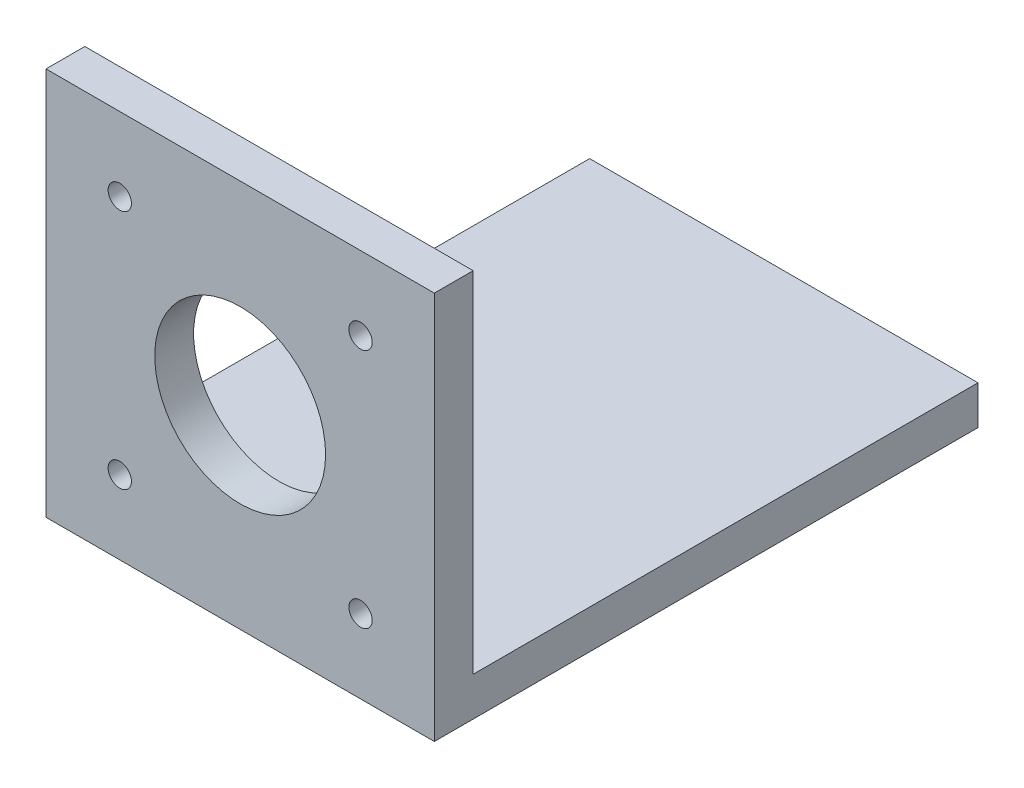
ISO-10303-21;
HEADER;
FILE_DESCRIPTION(('STEP AP214'),'2;1');
FILE_NAME('part.step','',(''),(''),'','','');
FILE_SCHEMA(('AUTOMOTIVE_DESIGN { 1 0 10303 214 1 1 1 1 }'));
ENDSEC;
DATA;
#1=APPLICATION_CONTEXT('core data for automotive mechanical design processes');
#2=APPLICATION_PROTOCOL_DEFINITION('international standard','automotive_design',2000,#1);
#3=PRODUCT_CONTEXT('',#1,'mechanical');
#4=PRODUCT('Part','Part','',(#3));
#5=PRODUCT_RELATED_PRODUCT_CATEGORY('part','',(#4));
#6=PRODUCT_DEFINITION_FORMATION('','',#4);
#7=PRODUCT_DEFINITION_CONTEXT('part definition',#1,'design');
#8=PRODUCT_DEFINITION('design','',#6,#7);
#9=PRODUCT_DEFINITION_SHAPE('','',#8);
#10=(LENGTH_UNIT() NAMED_UNIT(*) SI_UNIT(.MILLI.,.METRE.));
#11=(NAMED_UNIT(*) PLANE_ANGLE_UNIT() SI_UNIT($,.RADIAN.));
#12=(NAMED_UNIT(*) SI_UNIT($,.STERADIAN.) SOLID_ANGLE_UNIT());
#13=UNCERTAINTY_MEASURE_WITH_UNIT(LENGTH_MEASURE(1.E-05),#10,'distance_accuracy_value','');
#14=(GEOMETRIC_REPRESENTATION_CONTEXT(3) GLOBAL_UNCERTAINTY_ASSIGNED_CONTEXT((#13)) GLOBAL_UNIT_ASSIGNED_CONTEXT((#10,
#11,#12)) REPRESENTATION_CONTEXT('',''));
#15=CARTESIAN_POINT('',(0.,0.,0.));
#16=DIRECTION('',(0.,0.,1.));
#17=DIRECTION('',(1.,0.,0.));
#18=AXIS2_PLACEMENT_3D('',#15,#16,#17);
#19=CARTESIAN_POINT('',(50.,0.,0.));
#20=DIRECTION('',(0.,1.,0.));
#21=DIRECTION('',(0.,0.,1.));
#22=AXIS2_PLACEMENT_3D('',#19,#20,#21);
#23=PLANE('',#22);
#24=DIRECTION('',(0.,0.,-1.));
#25=VECTOR('',#24,1.);
#26=CARTESIAN_POINT('',(0.,0.,0.));
#27=LINE('',#26,#25);
#28=CARTESIAN_POINT('',(0.,0.,0.));
#29=VERTEX_POINT('',#28);
#30=CARTESIAN_POINT('',(0.,0.,-70.));
#31=VERTEX_POINT('',#30);
#32=EDGE_CURVE('E119',#29,#31,#27,.T.);
#33=ORIENTED_EDGE('',*,*,#32,.T.);
#34=DIRECTION('',(-1.,0.,0.));
#35=VECTOR('',#34,1.);
#36=CARTESIAN_POINT('',(50.,0.,-70.));
#37=LINE('',#36,#35);
#38=CARTESIAN_POINT('',(50.,0.,-70.));
#39=VERTEX_POINT('',#38);
#40=EDGE_CURVE('E11',#39,#31,#37,.T.);
#41=ORIENTED_EDGE('',*,*,#40,.F.);
#42=DIRECTION('',(0.,0.,-1.));
#43=VECTOR('',#42,1.);
#44=CARTESIAN_POINT('',(50.,0.,0.));
#45=LINE('',#44,#43);
#46=CARTESIAN_POINT('',(50.,0.,0.));
#47=VERTEX_POINT('',#46);
#48=EDGE_CURVE('E130',#47,#39,#45,.T.);
#49=ORIENTED_EDGE('',*,*,#48,.F.);
#50=DIRECTION('',(-1.,0.,0.));
#51=VECTOR('',#50,1.);
#52=CARTESIAN_POINT('',(50.,0.,0.));
#53=LINE('',#52,#51);
#54=EDGE_CURVE('E115',#47,#29,#53,.T.);
#55=ORIENTED_EDGE('',*,*,#54,.T.);
#56=EDGE_LOOP('',(#33,#41,#49,#55));
#57=FACE_BOUND('',#56,.T.);
#58=ADVANCED_FACE('F35',(#57),#23,.F.);
#59=CARTESIAN_POINT('',(50.,0.,-70.));
#60=DIRECTION('',(0.,0.,1.));
#61=DIRECTION('',(1.,0.,0.));
#62=AXIS2_PLACEMENT_3D('',#59,#60,#61);
#63=PLANE('',#62);
#64=DIRECTION('',(0.,1.,0.));
#65=VECTOR('',#64,1.);
#66=CARTESIAN_POINT('',(0.,0.,-70.));
#67=LINE('',#66,#65);
#68=CARTESIAN_POINT('',(0.,5.,-70.));
#69=VERTEX_POINT('',#68);
#70=EDGE_CURVE('E122',#31,#69,#67,.T.);
#71=ORIENTED_EDGE('',*,*,#70,.T.);
#72=DIRECTION('',(-1.,0.,0.));
#73=VECTOR('',#72,1.);
#74=CARTESIAN_POINT('',(50.,5.,-70.));
#75=LINE('',#74,#73);
#76=CARTESIAN_POINT('',(50.,5.,-70.));
#77=VERTEX_POINT('',#76);
#78=EDGE_CURVE('E43',#77,#69,#75,.T.);
#79=ORIENTED_EDGE('',*,*,#78,.F.);
#80=DIRECTION('',(0.,1.,0.));
#81=VECTOR('',#80,1.);
#82=CARTESIAN_POINT('',(50.,0.,-70.));
#83=LINE('',#82,#81);
#84=EDGE_CURVE('E88',#39,#77,#83,.T.);
#85=ORIENTED_EDGE('',*,*,#84,.F.);
#86=ORIENTED_EDGE('',*,*,#40,.T.);
#87=EDGE_LOOP('',(#71,#79,#85,#86));
#88=FACE_BOUND('',#87,.T.);
#89=ADVANCED_FACE('F157',(#88),#63,.F.);
#90=CARTESIAN_POINT('',(50.,5.,-5.));
#91=DIRECTION('',(0.,-1.,0.));
#92=DIRECTION('',(0.,0.,-1.));
#93=AXIS2_PLACEMENT_3D('',#90,#91,#92);
#94=PLANE('',#93);
#95=DIRECTION('',(0.,0.,1.));
#96=VECTOR('',#95,1.);
#97=CARTESIAN_POINT('',(0.,5.,-5.));
#98=LINE('',#97,#96);
#99=CARTESIAN_POINT('',(0.,5.,-5.));
#100=VERTEX_POINT('',#99);
#101=EDGE_CURVE('E125',#69,#100,#98,.T.);
#102=ORIENTED_EDGE('',*,*,#101,.T.);
#103=DIRECTION('',(-1.,0.,0.));
#104=VECTOR('',#103,1.);
#105=CARTESIAN_POINT('',(50.,5.,-5.));
#106=LINE('',#105,#104);
#107=CARTESIAN_POINT('',(50.,5.,-5.));
#108=VERTEX_POINT('',#107);
#109=EDGE_CURVE('E110',#108,#100,#106,.T.);
#110=ORIENTED_EDGE('',*,*,#109,.F.);
#111=DIRECTION('',(0.,0.,1.));
#112=VECTOR('',#111,1.);
#113=CARTESIAN_POINT('',(50.,5.,-5.));
#114=LINE('',#113,#112);
#115=EDGE_CURVE('E101',#77,#108,#114,.T.);
#116=ORIENTED_EDGE('',*,*,#115,.F.);
#117=ORIENTED_EDGE('',*,*,#78,.T.);
#118=EDGE_LOOP('',(#102,#110,#116,#117));
#119=FACE_BOUND('',#118,.T.);
#120=ADVANCED_FACE('F136',(#119),#94,.F.);
#121=CARTESIAN_POINT('',(50.,5.,-5.));
#122=DIRECTION('',(0.,0.,1.));
#123=DIRECTION('',(1.,0.,0.));
#124=AXIS2_PLACEMENT_3D('',#121,#122,#123);
#125=PLANE('',#124);
#126=CARTESIAN_POINT('',(40.5,9.5,-5.));
#127=DIRECTION('',(0.,0.,1.));
#128=DIRECTION('',(1.,0.,0.));
#129=AXIS2_PLACEMENT_3D('',#126,#127,#128);
#130=CIRCLE('',#129,1.5);
#131=CARTESIAN_POINT('',(42.,9.5,-5.));
#132=VERTEX_POINT('',#131);
#133=EDGE_CURVE('E173',#132,#132,#130,.F.);
#134=ORIENTED_EDGE('',*,*,#133,.F.);
#135=EDGE_LOOP('',(#134));
#136=FACE_BOUND('',#135,.T.);
#137=CARTESIAN_POINT('',(9.49999999999973,9.5,-5.));
#138=DIRECTION('',(0.,0.,1.));
#139=DIRECTION('',(1.,0.,0.));
#140=AXIS2_PLACEMENT_3D('',#137,#138,#139);
#141=CIRCLE('',#140,1.50000000000001);
#142=CARTESIAN_POINT('',(10.9999999999997,9.5,-5.));
#143=VERTEX_POINT('',#142);
#144=EDGE_CURVE('E177',#143,#143,#141,.F.);
#145=ORIENTED_EDGE('',*,*,#144,.F.);
#146=EDGE_LOOP('',(#145));
#147=FACE_BOUND('',#146,.T.);
#148=CARTESIAN_POINT('',(9.49999999999973,40.5,-5.));
#149=DIRECTION('',(0.,0.,1.));
#150=DIRECTION('',(1.,0.,0.));
#151=AXIS2_PLACEMENT_3D('',#148,#149,#150);
#152=CIRCLE('',#151,1.50000000000001);
#153=CARTESIAN_POINT('',(10.9999999999997,40.5,-5.));
#154=VERTEX_POINT('',#153);
#155=EDGE_CURVE('E181',#154,#154,#152,.F.);
#156=ORIENTED_EDGE('',*,*,#155,.F.);
#157=EDGE_LOOP('',(#156));
#158=FACE_BOUND('',#157,.T.);
#159=CARTESIAN_POINT('',(40.5,40.5,-5.));
#160=DIRECTION('',(0.,0.,1.));
#161=DIRECTION('',(1.,0.,0.));
#162=AXIS2_PLACEMENT_3D('',#159,#160,#161);
#163=CIRCLE('',#162,1.5);
#164=CARTESIAN_POINT('',(42.,40.5,-5.));
#165=VERTEX_POINT('',#164);
#166=EDGE_CURVE('E185',#165,#165,#163,.F.);
#167=ORIENTED_EDGE('',*,*,#166,.F.);
#168=EDGE_LOOP('',(#167));
#169=FACE_BOUND('',#168,.T.);
#170=CARTESIAN_POINT('',(25.0000000000028,25.0000000000028,-5.));
#171=DIRECTION('',(0.,0.,1.));
#172=DIRECTION('',(1.,0.,0.));
#173=AXIS2_PLACEMENT_3D('',#170,#171,#172);
#174=CIRCLE('',#173,11.);
#175=CARTESIAN_POINT('',(36.0000000000028,25.0000000000028,-5.));
#176=VERTEX_POINT('',#175);
#177=EDGE_CURVE('E123',#176,#176,#174,.F.);
#178=ORIENTED_EDGE('',*,*,#177,.F.);
#179=EDGE_LOOP('',(#178));
#180=FACE_BOUND('',#179,.T.);
#181=DIRECTION('',(0.,1.,0.));
#182=VECTOR('',#181,1.);
#183=CARTESIAN_POINT('',(0.,5.,-5.));
#184=LINE('',#183,#182);
#185=CARTESIAN_POINT('',(0.,50.,-5.));
#186=VERTEX_POINT('',#185);
#187=EDGE_CURVE('E109',#100,#186,#184,.T.);
#188=ORIENTED_EDGE('',*,*,#187,.T.);
#189=DIRECTION('',(-1.,0.,0.));
#190=VECTOR('',#189,1.);
#191=CARTESIAN_POINT('',(50.,50.,-5.));
#192=LINE('',#191,#190);
#193=CARTESIAN_POINT('',(50.,50.,-5.));
#194=VERTEX_POINT('',#193);
#195=EDGE_CURVE('E106',#194,#186,#192,.T.);
#196=ORIENTED_EDGE('',*,*,#195,.F.);
#197=DIRECTION('',(0.,1.,0.));
#198=VECTOR('',#197,1.);
#199=CARTESIAN_POINT('',(50.,5.,-5.));
#200=LINE('',#199,#198);
#201=EDGE_CURVE('E95',#108,#194,#200,.T.);
#202=ORIENTED_EDGE('',*,*,#201,.F.);
#203=ORIENTED_EDGE('',*,*,#109,.T.);
#204=EDGE_LOOP('',(#188,#196,#202,#203));
#205=FACE_BOUND('',#204,.T.);
#206=ADVANCED_FACE('F107',(#136,#147,#158,#169,#180,#205),#125,.F.);
#207=CARTESIAN_POINT('',(50.,50.,0.));
#208=DIRECTION('',(0.,-1.,0.));
#209=DIRECTION('',(0.,0.,-1.));
#210=AXIS2_PLACEMENT_3D('',#207,#208,#209);
#211=PLANE('',#210);
#212=DIRECTION('',(0.,0.,1.));
#213=VECTOR('',#212,1.);
#214=CARTESIAN_POINT('',(0.,50.,0.));
#215=LINE('',#214,#213);
#216=CARTESIAN_POINT('',(0.,50.,0.));
#217=VERTEX_POINT('',#216);
#218=EDGE_CURVE('E74',#186,#217,#215,.T.);
#219=ORIENTED_EDGE('',*,*,#218,.T.);
#220=DIRECTION('',(-1.,0.,0.));
#221=VECTOR('',#220,1.);
#222=CARTESIAN_POINT('',(50.,50.,0.));
#223=LINE('',#222,#221);
#224=CARTESIAN_POINT('',(50.,50.,0.));
#225=VERTEX_POINT('',#224);
#226=EDGE_CURVE('E111',#225,#217,#223,.T.);
#227=ORIENTED_EDGE('',*,*,#226,.F.);
#228=DIRECTION('',(0.,0.,1.));
#229=VECTOR('',#228,1.);
#230=CARTESIAN_POINT('',(50.,50.,0.));
#231=LINE('',#230,#229);
#232=EDGE_CURVE('E99',#194,#225,#231,.T.);
#233=ORIENTED_EDGE('',*,*,#232,.F.);
#234=ORIENTED_EDGE('',*,*,#195,.T.);
#235=EDGE_LOOP('',(#219,#227,#233,#234));
#236=FACE_BOUND('',#235,.T.);
#237=ADVANCED_FACE('F113',(#236),#211,.F.);
#238=CARTESIAN_POINT('',(50.,0.,0.));
#239=DIRECTION('',(0.,0.,-1.));
#240=DIRECTION('',(-1.,0.,0.));
#241=AXIS2_PLACEMENT_3D('',#238,#239,#240);
#242=PLANE('',#241);
#243=CARTESIAN_POINT('',(40.5,9.5,0.));
#244=DIRECTION('',(0.,0.,1.));
#245=DIRECTION('',(-1.,0.,0.));
#246=AXIS2_PLACEMENT_3D('',#243,#244,#245);
#247=CIRCLE('',#246,1.5);
#248=CARTESIAN_POINT('',(39.,9.5,0.));
#249=VERTEX_POINT('',#248);
#250=EDGE_CURVE('E198',#249,#249,#247,.T.);
#251=ORIENTED_EDGE('',*,*,#250,.F.);
#252=EDGE_LOOP('',(#251));
#253=FACE_BOUND('',#252,.T.);
#254=CARTESIAN_POINT('',(9.49999999999973,9.5,0.));
#255=DIRECTION('',(0.,0.,1.));
#256=DIRECTION('',(1.,0.,0.));
#257=AXIS2_PLACEMENT_3D('',#254,#255,#256);
#258=CIRCLE('',#257,1.50000000000001);
#259=CARTESIAN_POINT('',(10.9999999999997,9.5,0.));
#260=VERTEX_POINT('',#259);
#261=EDGE_CURVE('E197',#260,#260,#258,.T.);
#262=ORIENTED_EDGE('',*,*,#261,.F.);
#263=EDGE_LOOP('',(#262));
#264=FACE_BOUND('',#263,.T.);
#265=CARTESIAN_POINT('',(9.49999999999973,40.5,0.));
#266=DIRECTION('',(0.,0.,1.));
#267=DIRECTION('',(-1.,0.,0.));
#268=AXIS2_PLACEMENT_3D('',#265,#266,#267);
#269=CIRCLE('',#268,1.50000000000001);
#270=CARTESIAN_POINT('',(7.99999999999973,40.5,0.));
#271=VERTEX_POINT('',#270);
#272=EDGE_CURVE('E202',#271,#271,#269,.T.);
#273=ORIENTED_EDGE('',*,*,#272,.F.);
#274=EDGE_LOOP('',(#273));
#275=FACE_BOUND('',#274,.T.);
#276=CARTESIAN_POINT('',(40.5,40.5,0.));
#277=DIRECTION('',(0.,0.,1.));
#278=DIRECTION('',(1.,0.,0.));
#279=AXIS2_PLACEMENT_3D('',#276,#277,#278);
#280=CIRCLE('',#279,1.5);
#281=CARTESIAN_POINT('',(42.,40.5,0.));
#282=VERTEX_POINT('',#281);
#283=EDGE_CURVE('E206',#282,#282,#280,.T.);
#284=ORIENTED_EDGE('',*,*,#283,.F.);
#285=EDGE_LOOP('',(#284));
#286=FACE_BOUND('',#285,.T.);
#287=CARTESIAN_POINT('',(25.0000000000028,25.0000000000028,0.));
#288=DIRECTION('',(0.,0.,1.));
#289=DIRECTION('',(1.,0.,0.));
#290=AXIS2_PLACEMENT_3D('',#287,#288,#289);
#291=CIRCLE('',#290,11.);
#292=CARTESIAN_POINT('',(36.0000000000028,25.0000000000028,0.));
#293=VERTEX_POINT('',#292);
#294=EDGE_CURVE('E189',#293,#293,#291,.T.);
#295=ORIENTED_EDGE('',*,*,#294,.F.);
#296=EDGE_LOOP('',(#295));
#297=FACE_BOUND('',#296,.T.);
#298=DIRECTION('',(0.,-1.,0.));
#299=VECTOR('',#298,1.);
#300=CARTESIAN_POINT('',(0.,0.,0.));
#301=LINE('',#300,#299);
#302=EDGE_CURVE('E80',#217,#29,#301,.T.);
#303=ORIENTED_EDGE('',*,*,#302,.T.);
#304=ORIENTED_EDGE('',*,*,#54,.F.);
#305=DIRECTION('',(0.,-1.,0.));
#306=VECTOR('',#305,1.);
#307=CARTESIAN_POINT('',(50.,0.,0.));
#308=LINE('',#307,#306);
#309=EDGE_CURVE('E51',#225,#47,#308,.T.);
#310=ORIENTED_EDGE('',*,*,#309,.F.);
#311=ORIENTED_EDGE('',*,*,#226,.T.);
#312=EDGE_LOOP('',(#303,#304,#310,#311));
#313=FACE_BOUND('',#312,.T.);
#314=ADVANCED_FACE('F143',(#253,#264,#275,#286,#297,#313),#242,.F.);
#315=CARTESIAN_POINT('',(50.,0.,0.));
#316=DIRECTION('',(1.,0.,0.));
#317=DIRECTION('',(0.,0.,-1.));
#318=AXIS2_PLACEMENT_3D('',#315,#316,#317);
#319=PLANE('',#318);
#320=ORIENTED_EDGE('',*,*,#48,.T.);
#321=ORIENTED_EDGE('',*,*,#84,.T.);
#322=ORIENTED_EDGE('',*,*,#115,.T.);
#323=ORIENTED_EDGE('',*,*,#201,.T.);
#324=ORIENTED_EDGE('',*,*,#232,.T.);
#325=ORIENTED_EDGE('',*,*,#309,.T.);
#326=EDGE_LOOP('',(#320,#321,#322,#323,#324,#325));
#327=FACE_BOUND('',#326,.T.);
#328=ADVANCED_FACE('F97',(#327),#319,.T.);
#329=CARTESIAN_POINT('',(0.,0.,0.));
#330=DIRECTION('',(1.,0.,0.));
#331=DIRECTION('',(0.,0.,-1.));
#332=AXIS2_PLACEMENT_3D('',#329,#330,#331);
#333=PLANE('',#332);
#334=ORIENTED_EDGE('',*,*,#32,.F.);
#335=ORIENTED_EDGE('',*,*,#302,.F.);
#336=ORIENTED_EDGE('',*,*,#218,.F.);
#337=ORIENTED_EDGE('',*,*,#187,.F.);
#338=ORIENTED_EDGE('',*,*,#101,.F.);
#339=ORIENTED_EDGE('',*,*,#70,.F.);
#340=EDGE_LOOP('',(#334,#335,#336,#337,#338,#339));
#341=FACE_BOUND('',#340,.T.);
#342=ADVANCED_FACE('F139',(#341),#333,.F.);
#343=CARTESIAN_POINT('',(25.0000000000028,25.0000000000028,-70.001));
#344=DIRECTION('',(0.,0.,1.));
#345=DIRECTION('',(1.,0.,0.));
#346=AXIS2_PLACEMENT_3D('',#343,#344,#345);
#347=CYLINDRICAL_SURFACE('',#346,11.);
#348=ORIENTED_EDGE('',*,*,#294,.T.);
#349=EDGE_LOOP('',(#348));
#350=FACE_BOUND('',#349,.T.);
#351=ORIENTED_EDGE('',*,*,#177,.T.);
#352=EDGE_LOOP('',(#351));
#353=FACE_BOUND('',#352,.T.);
#354=ADVANCED_FACE('F219',(#350,#353),#347,.F.);
#355=CARTESIAN_POINT('',(40.5,40.5,-70.001));
#356=DIRECTION('',(0.,0.,1.));
#357=DIRECTION('',(1.,0.,0.));
#358=AXIS2_PLACEMENT_3D('',#355,#356,#357);
#359=CYLINDRICAL_SURFACE('',#358,1.5);
#360=ORIENTED_EDGE('',*,*,#283,.T.);
#361=EDGE_LOOP('',(#360));
#362=FACE_BOUND('',#361,.T.);
#363=ORIENTED_EDGE('',*,*,#166,.T.);
#364=EDGE_LOOP('',(#363));
#365=FACE_BOUND('',#364,.T.);
#366=ADVANCED_FACE('F213',(#362,#365),#359,.F.);
#367=CARTESIAN_POINT('',(9.49999999999973,40.5,-70.001));
#368=DIRECTION('',(0.,0.,1.));
#369=DIRECTION('',(1.,0.,0.));
#370=AXIS2_PLACEMENT_3D('',#367,#368,#369);
#371=CYLINDRICAL_SURFACE('',#370,1.50000000000001);
#372=ORIENTED_EDGE('',*,*,#272,.T.);
#373=EDGE_LOOP('',(#372));
#374=FACE_BOUND('',#373,.T.);
#375=ORIENTED_EDGE('',*,*,#155,.T.);
#376=EDGE_LOOP('',(#375));
#377=FACE_BOUND('',#376,.T.);
#378=ADVANCED_FACE('F226',(#374,#377),#371,.F.);
#379=CARTESIAN_POINT('',(9.49999999999973,9.5,-70.001));
#380=DIRECTION('',(0.,0.,1.));
#381=DIRECTION('',(1.,0.,0.));
#382=AXIS2_PLACEMENT_3D('',#379,#380,#381);
#383=CYLINDRICAL_SURFACE('',#382,1.50000000000001);
#384=ORIENTED_EDGE('',*,*,#261,.T.);
#385=EDGE_LOOP('',(#384));
#386=FACE_BOUND('',#385,.T.);
#387=ORIENTED_EDGE('',*,*,#144,.T.);
#388=EDGE_LOOP('',(#387));
#389=FACE_BOUND('',#388,.T.);
#390=ADVANCED_FACE('F232',(#386,#389),#383,.F.);
#391=CARTESIAN_POINT('',(40.5,9.5,-70.001));
#392=DIRECTION('',(0.,0.,1.));
#393=DIRECTION('',(1.,0.,0.));
#394=AXIS2_PLACEMENT_3D('',#391,#392,#393);
#395=CYLINDRICAL_SURFACE('',#394,1.5);
#396=ORIENTED_EDGE('',*,*,#250,.T.);
#397=EDGE_LOOP('',(#396));
#398=FACE_BOUND('',#397,.T.);
#399=ORIENTED_EDGE('',*,*,#133,.T.);
#400=EDGE_LOOP('',(#399));
#401=FACE_BOUND('',#400,.T.);
#402=ADVANCED_FACE('F229',(#398,#401),#395,.F.);
#403=CLOSED_SHELL('',(#58,#89,#120,#206,#237,#314,#328,#342,#354,#366,#378,#390,#402));
#404=MANIFOLD_SOLID_BREP('B2',#403);
#405=ADVANCED_BREP_SHAPE_REPRESENTATION('',(#18,#404),#14);
#406=SHAPE_DEFINITION_REPRESENTATION(#9,#405);
ENDSEC;
END-ISO-10303-21;
